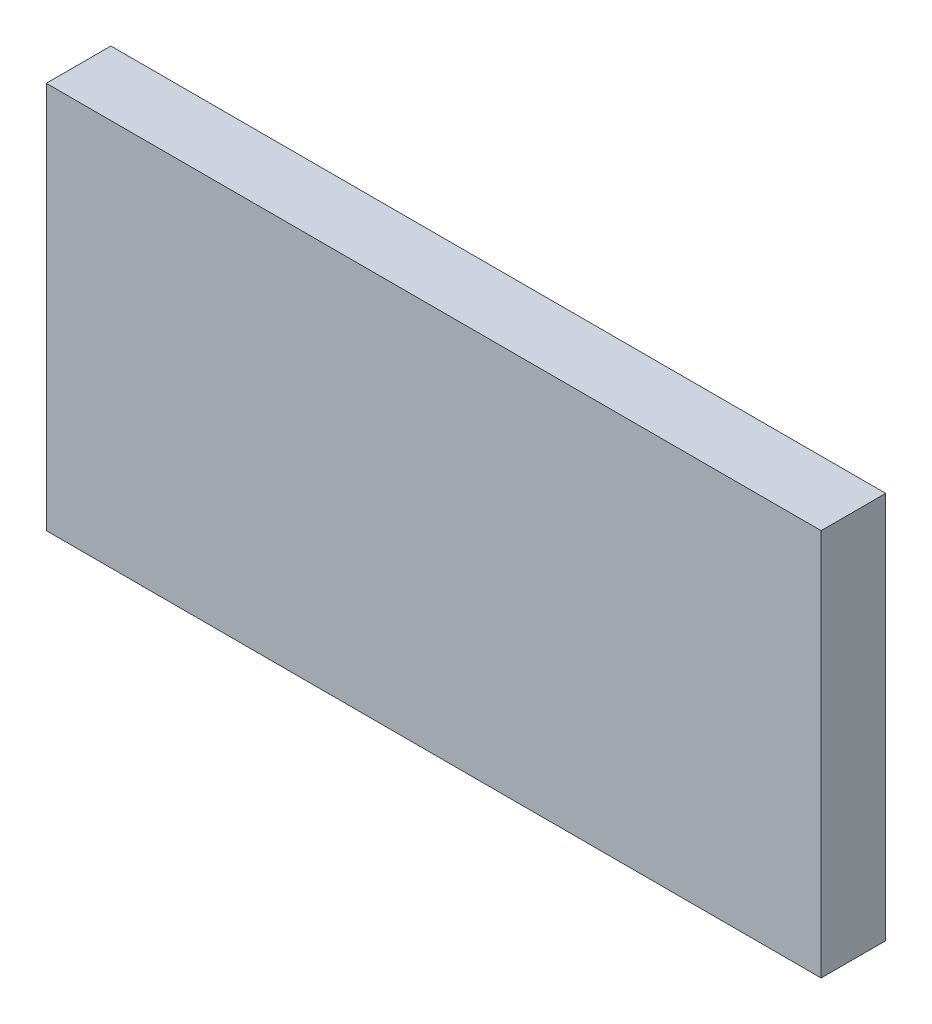
ISO-10303-21;
HEADER;
FILE_DESCRIPTION(('STEP AP214'),'2;1');
FILE_NAME('part.step','',(''),(''),'','','');
FILE_SCHEMA(('AUTOMOTIVE_DESIGN { 1 0 10303 214 1 1 1 1 }'));
ENDSEC;
DATA;
#1=APPLICATION_CONTEXT('core data for automotive mechanical design processes');
#2=APPLICATION_PROTOCOL_DEFINITION('international standard','automotive_design',2000,#1);
#3=PRODUCT_CONTEXT('',#1,'mechanical');
#4=PRODUCT('Part','Part','',(#3));
#5=PRODUCT_RELATED_PRODUCT_CATEGORY('part','',(#4));
#6=PRODUCT_DEFINITION_FORMATION('','',#4);
#7=PRODUCT_DEFINITION_CONTEXT('part definition',#1,'design');
#8=PRODUCT_DEFINITION('design','',#6,#7);
#9=PRODUCT_DEFINITION_SHAPE('','',#8);
#10=(LENGTH_UNIT() NAMED_UNIT(*) SI_UNIT(.MILLI.,.METRE.));
#11=(NAMED_UNIT(*) PLANE_ANGLE_UNIT() SI_UNIT($,.RADIAN.));
#12=(NAMED_UNIT(*) SI_UNIT($,.STERADIAN.) SOLID_ANGLE_UNIT());
#13=UNCERTAINTY_MEASURE_WITH_UNIT(LENGTH_MEASURE(1.E-05),#10,'distance_accuracy_value','');
#14=(GEOMETRIC_REPRESENTATION_CONTEXT(3) GLOBAL_UNCERTAINTY_ASSIGNED_CONTEXT((#13)) GLOBAL_UNIT_ASSIGNED_CONTEXT((#10,
#11,#12)) REPRESENTATION_CONTEXT('',''));
#15=CARTESIAN_POINT('',(0.,0.,0.));
#16=DIRECTION('',(0.,0.,1.));
#17=DIRECTION('',(1.,0.,0.));
#18=AXIS2_PLACEMENT_3D('',#15,#16,#17);
#19=CARTESIAN_POINT('',(0.,0.,5.));
#20=DIRECTION('',(1.,0.,0.));
#21=DIRECTION('',(0.,0.,-1.));
#22=AXIS2_PLACEMENT_3D('',#19,#20,#21);
#23=PLANE('',#22);
#24=DIRECTION('',(0.,-1.,0.));
#25=VECTOR('',#24,1.);
#26=CARTESIAN_POINT('',(0.,0.,0.));
#27=LINE('',#26,#25);
#28=CARTESIAN_POINT('',(0.,30.,0.));
#29=VERTEX_POINT('',#28);
#30=CARTESIAN_POINT('',(0.,0.,0.));
#31=VERTEX_POINT('',#30);
#32=EDGE_CURVE('E96',#29,#31,#27,.T.);
#33=ORIENTED_EDGE('',*,*,#32,.T.);
#34=DIRECTION('',(0.,0.,-1.));
#35=VECTOR('',#34,1.);
#36=CARTESIAN_POINT('',(0.,0.,5.));
#37=LINE('',#36,#35);
#38=CARTESIAN_POINT('',(0.,0.,5.));
#39=VERTEX_POINT('',#38);
#40=EDGE_CURVE('E11',#39,#31,#37,.T.);
#41=ORIENTED_EDGE('',*,*,#40,.F.);
#42=DIRECTION('',(0.,-1.,0.));
#43=VECTOR('',#42,1.);
#44=CARTESIAN_POINT('',(0.,0.,5.));
#45=LINE('',#44,#43);
#46=CARTESIAN_POINT('',(0.,30.,5.));
#47=VERTEX_POINT('',#46);
#48=EDGE_CURVE('E84',#47,#39,#45,.T.);
#49=ORIENTED_EDGE('',*,*,#48,.F.);
#50=DIRECTION('',(0.,0.,-1.));
#51=VECTOR('',#50,1.);
#52=CARTESIAN_POINT('',(0.,30.,5.));
#53=LINE('',#52,#51);
#54=EDGE_CURVE('E92',#47,#29,#53,.T.);
#55=ORIENTED_EDGE('',*,*,#54,.T.);
#56=EDGE_LOOP('',(#33,#41,#49,#55));
#57=FACE_BOUND('',#56,.T.);
#58=ADVANCED_FACE('F33',(#57),#23,.F.);
#59=CARTESIAN_POINT('',(0.,0.,5.));
#60=DIRECTION('',(0.,1.,0.));
#61=DIRECTION('',(0.,0.,1.));
#62=AXIS2_PLACEMENT_3D('',#59,#60,#61);
#63=PLANE('',#62);
#64=DIRECTION('',(1.,0.,0.));
#65=VECTOR('',#64,1.);
#66=CARTESIAN_POINT('',(0.,0.,0.));
#67=LINE('',#66,#65);
#68=CARTESIAN_POINT('',(60.,0.,0.));
#69=VERTEX_POINT('',#68);
#70=EDGE_CURVE('E88',#31,#69,#67,.T.);
#71=ORIENTED_EDGE('',*,*,#70,.T.);
#72=DIRECTION('',(0.,0.,-1.));
#73=VECTOR('',#72,1.);
#74=CARTESIAN_POINT('',(60.,0.,5.));
#75=LINE('',#74,#73);
#76=CARTESIAN_POINT('',(60.,0.,5.));
#77=VERTEX_POINT('',#76);
#78=EDGE_CURVE('E41',#77,#69,#75,.T.);
#79=ORIENTED_EDGE('',*,*,#78,.F.);
#80=DIRECTION('',(1.,0.,0.));
#81=VECTOR('',#80,1.);
#82=CARTESIAN_POINT('',(0.,0.,5.));
#83=LINE('',#82,#81);
#84=EDGE_CURVE('E79',#39,#77,#83,.T.);
#85=ORIENTED_EDGE('',*,*,#84,.F.);
#86=ORIENTED_EDGE('',*,*,#40,.T.);
#87=EDGE_LOOP('',(#71,#79,#85,#86));
#88=FACE_BOUND('',#87,.T.);
#89=ADVANCED_FACE('F87',(#88),#63,.F.);
#90=CARTESIAN_POINT('',(60.,0.,5.));
#91=DIRECTION('',(-1.,0.,0.));
#92=DIRECTION('',(0.,0.,1.));
#93=AXIS2_PLACEMENT_3D('',#90,#91,#92);
#94=PLANE('',#93);
#95=DIRECTION('',(0.,1.,0.));
#96=VECTOR('',#95,1.);
#97=CARTESIAN_POINT('',(60.,0.,0.));
#98=LINE('',#97,#96);
#99=CARTESIAN_POINT('',(60.,30.,0.));
#100=VERTEX_POINT('',#99);
#101=EDGE_CURVE('E66',#69,#100,#98,.T.);
#102=ORIENTED_EDGE('',*,*,#101,.T.);
#103=DIRECTION('',(0.,0.,-1.));
#104=VECTOR('',#103,1.);
#105=CARTESIAN_POINT('',(60.,30.,5.));
#106=LINE('',#105,#104);
#107=CARTESIAN_POINT('',(60.,30.,5.));
#108=VERTEX_POINT('',#107);
#109=EDGE_CURVE('E89',#108,#100,#106,.T.);
#110=ORIENTED_EDGE('',*,*,#109,.F.);
#111=DIRECTION('',(0.,1.,0.));
#112=VECTOR('',#111,1.);
#113=CARTESIAN_POINT('',(60.,0.,5.));
#114=LINE('',#113,#112);
#115=EDGE_CURVE('E82',#77,#108,#114,.T.);
#116=ORIENTED_EDGE('',*,*,#115,.F.);
#117=ORIENTED_EDGE('',*,*,#78,.T.);
#118=EDGE_LOOP('',(#102,#110,#116,#117));
#119=FACE_BOUND('',#118,.T.);
#120=ADVANCED_FACE('F90',(#119),#94,.F.);
#121=CARTESIAN_POINT('',(0.,30.,5.));
#122=DIRECTION('',(0.,-1.,0.));
#123=DIRECTION('',(0.,0.,-1.));
#124=AXIS2_PLACEMENT_3D('',#121,#122,#123);
#125=PLANE('',#124);
#126=DIRECTION('',(-1.,0.,0.));
#127=VECTOR('',#126,1.);
#128=CARTESIAN_POINT('',(0.,30.,0.));
#129=LINE('',#128,#127);
#130=EDGE_CURVE('E72',#100,#29,#129,.T.);
#131=ORIENTED_EDGE('',*,*,#130,.T.);
#132=ORIENTED_EDGE('',*,*,#54,.F.);
#133=DIRECTION('',(-1.,0.,0.));
#134=VECTOR('',#133,1.);
#135=CARTESIAN_POINT('',(0.,30.,5.));
#136=LINE('',#135,#134);
#137=EDGE_CURVE('E49',#108,#47,#136,.T.);
#138=ORIENTED_EDGE('',*,*,#137,.F.);
#139=ORIENTED_EDGE('',*,*,#109,.T.);
#140=EDGE_LOOP('',(#131,#132,#138,#139));
#141=FACE_BOUND('',#140,.T.);
#142=ADVANCED_FACE('F103',(#141),#125,.F.);
#143=CARTESIAN_POINT('',(0.,0.,5.));
#144=DIRECTION('',(0.,0.,-1.));
#145=DIRECTION('',(-1.,0.,0.));
#146=AXIS2_PLACEMENT_3D('',#143,#144,#145);
#147=PLANE('',#146);
#148=ORIENTED_EDGE('',*,*,#48,.T.);
#149=ORIENTED_EDGE('',*,*,#84,.T.);
#150=ORIENTED_EDGE('',*,*,#115,.T.);
#151=ORIENTED_EDGE('',*,*,#137,.T.);
#152=EDGE_LOOP('',(#148,#149,#150,#151));
#153=FACE_BOUND('',#152,.T.);
#154=ADVANCED_FACE('F80',(#153),#147,.F.);
#155=CARTESIAN_POINT('',(0.,0.,0.));
#156=DIRECTION('',(0.,0.,-1.));
#157=DIRECTION('',(-1.,0.,0.));
#158=AXIS2_PLACEMENT_3D('',#155,#156,#157);
#159=PLANE('',#158);
#160=ORIENTED_EDGE('',*,*,#32,.F.);
#161=ORIENTED_EDGE('',*,*,#130,.F.);
#162=ORIENTED_EDGE('',*,*,#101,.F.);
#163=ORIENTED_EDGE('',*,*,#70,.F.);
#164=EDGE_LOOP('',(#160,#161,#162,#163));
#165=FACE_BOUND('',#164,.T.);
#166=ADVANCED_FACE('F106',(#165),#159,.T.);
#167=CLOSED_SHELL('',(#58,#89,#120,#142,#154,#166));
#168=MANIFOLD_SOLID_BREP('B2',#167);
#169=ADVANCED_BREP_SHAPE_REPRESENTATION('',(#18,#168),#14);
#170=SHAPE_DEFINITION_REPRESENTATION(#9,#169);
ENDSEC;
END-ISO-10303-21;
